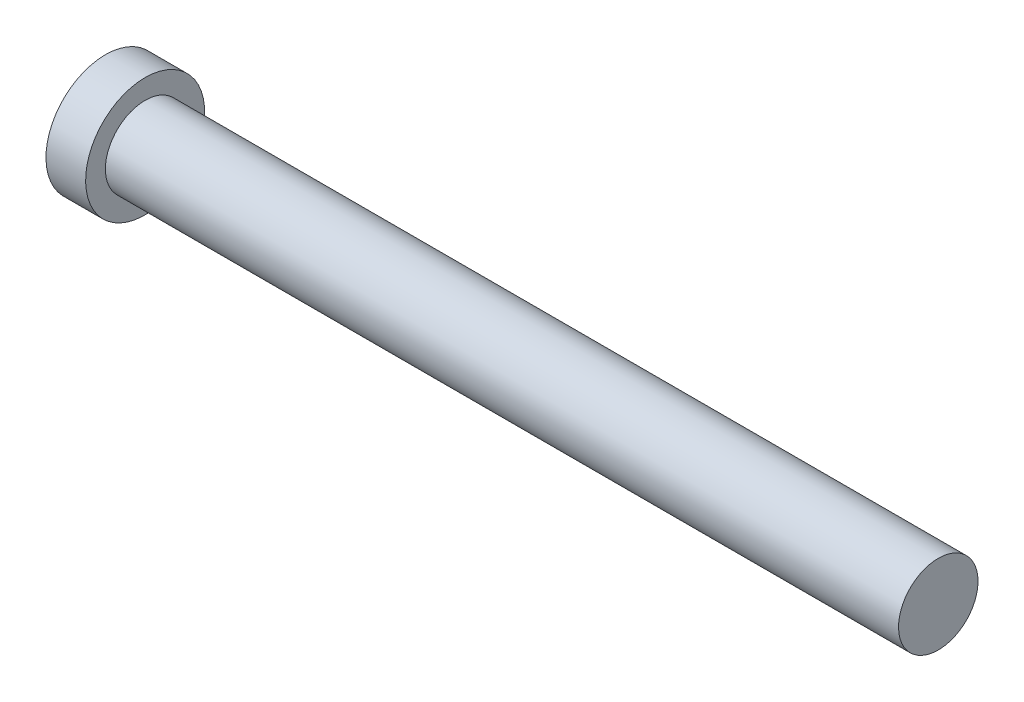
ISO-10303-21;
HEADER;
FILE_DESCRIPTION(('STEP AP214'),'2;1');
FILE_NAME('part.step','',(''),(''),'','','');
FILE_SCHEMA(('AUTOMOTIVE_DESIGN { 1 0 10303 214 1 1 1 1 }'));
ENDSEC;
DATA;
#1=APPLICATION_CONTEXT('core data for automotive mechanical design processes');
#2=APPLICATION_PROTOCOL_DEFINITION('international standard','automotive_design',2000,#1);
#3=PRODUCT_CONTEXT('',#1,'mechanical');
#4=PRODUCT('Part','Part','',(#3));
#5=PRODUCT_RELATED_PRODUCT_CATEGORY('part','',(#4));
#6=PRODUCT_DEFINITION_FORMATION('','',#4);
#7=PRODUCT_DEFINITION_CONTEXT('part definition',#1,'design');
#8=PRODUCT_DEFINITION('design','',#6,#7);
#9=PRODUCT_DEFINITION_SHAPE('','',#8);
#10=(LENGTH_UNIT() NAMED_UNIT(*) SI_UNIT(.MILLI.,.METRE.));
#11=(NAMED_UNIT(*) PLANE_ANGLE_UNIT() SI_UNIT($,.RADIAN.));
#12=(NAMED_UNIT(*) SI_UNIT($,.STERADIAN.) SOLID_ANGLE_UNIT());
#13=UNCERTAINTY_MEASURE_WITH_UNIT(LENGTH_MEASURE(1.E-05),#10,'distance_accuracy_value','');
#14=(GEOMETRIC_REPRESENTATION_CONTEXT(3) GLOBAL_UNCERTAINTY_ASSIGNED_CONTEXT((#13)) GLOBAL_UNIT_ASSIGNED_CONTEXT((#10,
#11,#12)) REPRESENTATION_CONTEXT('',''));
#15=CARTESIAN_POINT('',(0.,0.,0.));
#16=DIRECTION('',(0.,0.,1.));
#17=DIRECTION('',(1.,0.,0.));
#18=AXIS2_PLACEMENT_3D('',#15,#16,#17);
#19=CARTESIAN_POINT('',(133.35,0.,0.));
#20=DIRECTION('',(-1.,0.,0.));
#21=DIRECTION('',(0.,-1.,0.));
#22=AXIS2_PLACEMENT_3D('',#19,#20,#21);
#23=PLANE('',#22);
#24=CARTESIAN_POINT('',(133.35,0.,0.));
#25=DIRECTION('',(1.,0.,0.));
#26=DIRECTION('',(0.,1.,0.));
#27=AXIS2_PLACEMENT_3D('',#24,#25,#26);
#28=CIRCLE('',#27,6.36269999999999);
#29=CARTESIAN_POINT('',(133.35,6.3627,0.));
#30=VERTEX_POINT('',#29);
#31=EDGE_CURVE('E10',#30,#30,#28,.T.);
#32=ORIENTED_EDGE('',*,*,#31,.T.);
#33=EDGE_LOOP('',(#32));
#34=FACE_BOUND('',#33,.T.);
#35=ADVANCED_FACE('F31',(#34),#23,.F.);
#36=CARTESIAN_POINT('',(133.35,0.,0.));
#37=DIRECTION('',(1.,0.,0.));
#38=DIRECTION('',(0.,1.,0.));
#39=AXIS2_PLACEMENT_3D('',#36,#37,#38);
#40=CYLINDRICAL_SURFACE('',#39,6.36269999999999);
#41=ORIENTED_EDGE('',*,*,#31,.F.);
#42=EDGE_LOOP('',(#41));
#43=FACE_BOUND('',#42,.T.);
#44=CARTESIAN_POINT('',(6.34999999999999,0.,0.));
#45=DIRECTION('',(1.,0.,0.));
#46=DIRECTION('',(0.,1.,0.));
#47=AXIS2_PLACEMENT_3D('',#44,#45,#46);
#48=CIRCLE('',#47,6.3627);
#49=CARTESIAN_POINT('',(6.34999999999999,6.3627,0.));
#50=VERTEX_POINT('',#49);
#51=EDGE_CURVE('E37',#50,#50,#48,.T.);
#52=ORIENTED_EDGE('',*,*,#51,.T.);
#53=EDGE_LOOP('',(#52));
#54=FACE_BOUND('',#53,.T.);
#55=ADVANCED_FACE('F63',(#43,#54),#40,.T.);
#56=CARTESIAN_POINT('',(6.35,0.,0.));
#57=DIRECTION('',(-1.,0.,0.));
#58=DIRECTION('',(0.,-1.,0.));
#59=AXIS2_PLACEMENT_3D('',#56,#57,#58);
#60=PLANE('',#59);
#61=ORIENTED_EDGE('',*,*,#51,.F.);
#62=EDGE_LOOP('',(#61));
#63=FACE_BOUND('',#62,.T.);
#64=CARTESIAN_POINT('',(6.34999999999999,0.,0.));
#65=DIRECTION('',(1.,0.,0.));
#66=DIRECTION('',(0.,1.,0.));
#67=AXIS2_PLACEMENT_3D('',#64,#65,#66);
#68=CIRCLE('',#67,9.525);
#69=CARTESIAN_POINT('',(6.34999999999999,9.525,0.));
#70=VERTEX_POINT('',#69);
#71=EDGE_CURVE('E41',#70,#70,#68,.T.);
#72=ORIENTED_EDGE('',*,*,#71,.T.);
#73=EDGE_LOOP('',(#72));
#74=FACE_BOUND('',#73,.T.);
#75=ADVANCED_FACE('F59',(#63,#74),#60,.F.);
#76=CARTESIAN_POINT('',(133.35,0.,0.));
#77=DIRECTION('',(1.,0.,0.));
#78=DIRECTION('',(0.,1.,0.));
#79=AXIS2_PLACEMENT_3D('',#76,#77,#78);
#80=CYLINDRICAL_SURFACE('',#79,9.525);
#81=ORIENTED_EDGE('',*,*,#71,.F.);
#82=EDGE_LOOP('',(#81));
#83=FACE_BOUND('',#82,.T.);
#84=CARTESIAN_POINT('',(0.,0.,0.));
#85=DIRECTION('',(1.,0.,0.));
#86=DIRECTION('',(0.,1.,0.));
#87=AXIS2_PLACEMENT_3D('',#84,#85,#86);
#88=CIRCLE('',#87,9.525);
#89=CARTESIAN_POINT('',(0.,9.525,0.));
#90=VERTEX_POINT('',#89);
#91=EDGE_CURVE('E45',#90,#90,#88,.T.);
#92=ORIENTED_EDGE('',*,*,#91,.T.);
#93=EDGE_LOOP('',(#92));
#94=FACE_BOUND('',#93,.T.);
#95=ADVANCED_FACE('F51',(#83,#94),#80,.T.);
#96=CARTESIAN_POINT('',(0.,0.,0.));
#97=DIRECTION('',(1.,0.,0.));
#98=DIRECTION('',(0.,1.,0.));
#99=AXIS2_PLACEMENT_3D('',#96,#97,#98);
#100=PLANE('',#99);
#101=ORIENTED_EDGE('',*,*,#91,.F.);
#102=EDGE_LOOP('',(#101));
#103=FACE_BOUND('',#102,.T.);
#104=ADVANCED_FACE('F53',(#103),#100,.F.);
#105=CLOSED_SHELL('',(#35,#55,#75,#95,#104));
#106=MANIFOLD_SOLID_BREP('B2',#105);
#107=ADVANCED_BREP_SHAPE_REPRESENTATION('',(#18,#106),#14);
#108=SHAPE_DEFINITION_REPRESENTATION(#9,#107);
ENDSEC;
END-ISO-10303-21;
